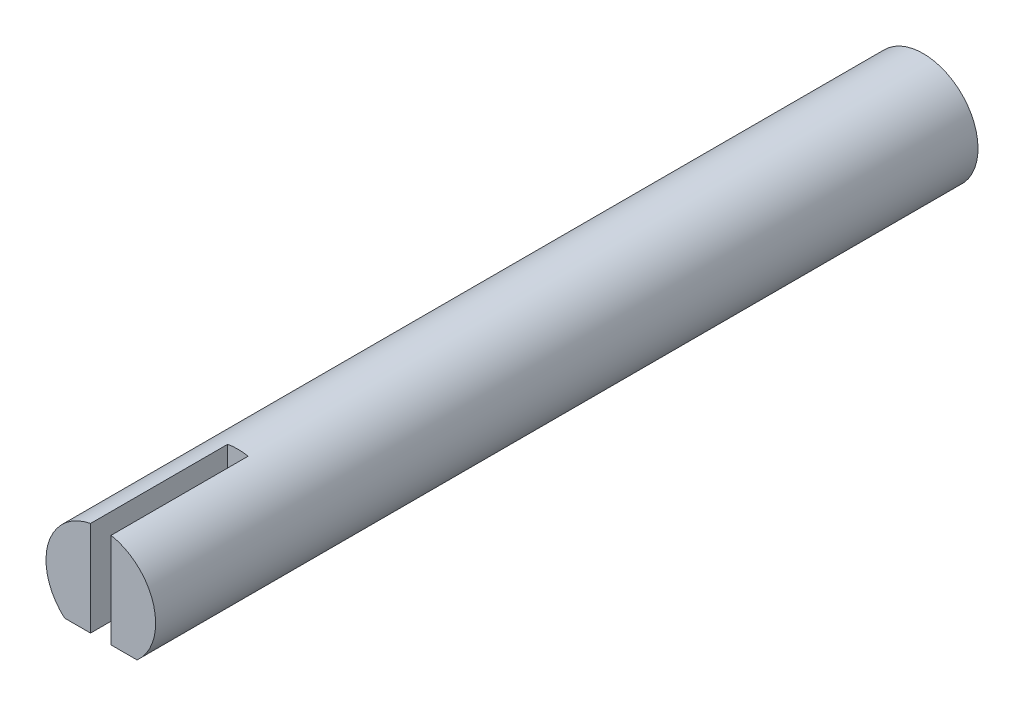
ISO-10303-21;
HEADER;
FILE_DESCRIPTION(('STEP AP214'),'2;1');
FILE_NAME('part.step','',(''),(''),'','','');
FILE_SCHEMA(('AUTOMOTIVE_DESIGN { 1 0 10303 214 1 1 1 1 }'));
ENDSEC;
DATA;
#1=APPLICATION_CONTEXT('core data for automotive mechanical design processes');
#2=APPLICATION_PROTOCOL_DEFINITION('international standard','automotive_design',2000,#1);
#3=PRODUCT_CONTEXT('',#1,'mechanical');
#4=PRODUCT('Part','Part','',(#3));
#5=PRODUCT_RELATED_PRODUCT_CATEGORY('part','',(#4));
#6=PRODUCT_DEFINITION_FORMATION('','',#4);
#7=PRODUCT_DEFINITION_CONTEXT('part definition',#1,'design');
#8=PRODUCT_DEFINITION('design','',#6,#7);
#9=PRODUCT_DEFINITION_SHAPE('','',#8);
#10=(LENGTH_UNIT() NAMED_UNIT(*) SI_UNIT(.MILLI.,.METRE.));
#11=(NAMED_UNIT(*) PLANE_ANGLE_UNIT() SI_UNIT($,.RADIAN.));
#12=(NAMED_UNIT(*) SI_UNIT($,.STERADIAN.) SOLID_ANGLE_UNIT());
#13=UNCERTAINTY_MEASURE_WITH_UNIT(LENGTH_MEASURE(1.E-05),#10,'distance_accuracy_value','');
#14=(GEOMETRIC_REPRESENTATION_CONTEXT(3) GLOBAL_UNCERTAINTY_ASSIGNED_CONTEXT((#13)) GLOBAL_UNIT_ASSIGNED_CONTEXT((#10,
#11,#12)) REPRESENTATION_CONTEXT('',''));
#15=CARTESIAN_POINT('',(0.,0.,0.));
#16=DIRECTION('',(0.,0.,1.));
#17=DIRECTION('',(1.,0.,0.));
#18=AXIS2_PLACEMENT_3D('',#15,#16,#17);
#19=CARTESIAN_POINT('',(0.,0.,60.));
#20=DIRECTION('',(0.,0.,1.));
#21=DIRECTION('',(1.,0.,0.));
#22=AXIS2_PLACEMENT_3D('',#19,#20,#21);
#23=PLANE('',#22);
#24=DIRECTION('',(0.,-1.,0.));
#25=VECTOR('',#24,1.);
#26=CARTESIAN_POINT('',(-0.75,0.,60.));
#27=LINE('',#26,#25);
#28=CARTESIAN_POINT('',(-0.75,3.92905841137543,60.));
#29=VERTEX_POINT('',#28);
#30=CARTESIAN_POINT('',(-0.75,-3.,60.));
#31=VERTEX_POINT('',#30);
#32=EDGE_CURVE('E48',#29,#31,#27,.T.);
#33=ORIENTED_EDGE('',*,*,#32,.F.);
#34=CARTESIAN_POINT('',(0.,0.,60.));
#35=DIRECTION('',(0.,0.,1.));
#36=DIRECTION('',(1.,0.,0.));
#37=AXIS2_PLACEMENT_3D('',#34,#35,#36);
#38=CIRCLE('',#37,4.);
#39=CARTESIAN_POINT('',(-2.64575131106459,-3.,60.));
#40=VERTEX_POINT('',#39);
#41=EDGE_CURVE('E89',#29,#40,#38,.T.);
#42=ORIENTED_EDGE('',*,*,#41,.T.);
#43=DIRECTION('',(1.,0.,0.));
#44=VECTOR('',#43,1.);
#45=CARTESIAN_POINT('',(-2.64575131106459,-3.,60.));
#46=LINE('',#45,#44);
#47=EDGE_CURVE('E97',#40,#31,#46,.T.);
#48=ORIENTED_EDGE('',*,*,#47,.T.);
#49=EDGE_LOOP('',(#33,#42,#48));
#50=FACE_BOUND('',#49,.T.);
#51=ADVANCED_FACE('F39',(#50),#23,.T.);
#52=CARTESIAN_POINT('',(0.,0.,60.));
#53=DIRECTION('',(0.,0.,-1.));
#54=DIRECTION('',(-1.,0.,0.));
#55=AXIS2_PLACEMENT_3D('',#52,#53,#54);
#56=CYLINDRICAL_SURFACE('',#55,4.);
#57=ORIENTED_EDGE('',*,*,#41,.F.);
#58=DIRECTION('',(0.,0.,-1.));
#59=VECTOR('',#58,1.);
#60=CARTESIAN_POINT('',(-0.75,3.92905841137543,60.));
#61=LINE('',#60,#59);
#62=CARTESIAN_POINT('',(-0.75,3.92905841137543,50.));
#63=VERTEX_POINT('',#62);
#64=EDGE_CURVE('E105',#29,#63,#61,.T.);
#65=ORIENTED_EDGE('',*,*,#64,.T.);
#66=CARTESIAN_POINT('',(0.,0.,50.));
#67=DIRECTION('',(0.,0.,1.));
#68=DIRECTION('',(1.,0.,0.));
#69=AXIS2_PLACEMENT_3D('',#66,#67,#68);
#70=CIRCLE('',#69,4.);
#71=CARTESIAN_POINT('',(0.75,3.92905841137543,50.));
#72=VERTEX_POINT('',#71);
#73=EDGE_CURVE('E101',#72,#63,#70,.T.);
#74=ORIENTED_EDGE('',*,*,#73,.F.);
#75=DIRECTION('',(0.,0.,-1.));
#76=VECTOR('',#75,1.);
#77=CARTESIAN_POINT('',(0.75,3.92905841137543,60.));
#78=LINE('',#77,#76);
#79=CARTESIAN_POINT('',(0.75,3.92905841137543,60.));
#80=VERTEX_POINT('',#79);
#81=EDGE_CURVE('E133',#72,#80,#78,.F.);
#82=ORIENTED_EDGE('',*,*,#81,.T.);
#83=CARTESIAN_POINT('',(2.64575131106459,-3.,60.));
#84=VERTEX_POINT('',#83);
#85=EDGE_CURVE('E95',#84,#80,#38,.T.);
#86=ORIENTED_EDGE('',*,*,#85,.F.);
#87=DIRECTION('',(0.,0.,-1.));
#88=VECTOR('',#87,1.);
#89=CARTESIAN_POINT('',(2.64575131106459,-3.,60.));
#90=LINE('',#89,#88);
#91=CARTESIAN_POINT('',(2.64575131106459,-3.,0.));
#92=VERTEX_POINT('',#91);
#93=EDGE_CURVE('E80',#84,#92,#90,.T.);
#94=ORIENTED_EDGE('',*,*,#93,.T.);
#95=CARTESIAN_POINT('',(0.,0.,0.));
#96=DIRECTION('',(0.,0.,1.));
#97=DIRECTION('',(1.,0.,0.));
#98=AXIS2_PLACEMENT_3D('',#95,#96,#97);
#99=CIRCLE('',#98,4.);
#100=CARTESIAN_POINT('',(-2.64575131106459,-3.,0.));
#101=VERTEX_POINT('',#100);
#102=EDGE_CURVE('E90',#92,#101,#99,.T.);
#103=ORIENTED_EDGE('',*,*,#102,.T.);
#104=DIRECTION('',(0.,0.,-1.));
#105=VECTOR('',#104,1.);
#106=CARTESIAN_POINT('',(-2.64575131106459,-3.,60.));
#107=LINE('',#106,#105);
#108=EDGE_CURVE('E84',#40,#101,#107,.T.);
#109=ORIENTED_EDGE('',*,*,#108,.F.);
#110=EDGE_LOOP('',(#57,#65,#74,#82,#86,#94,#103,#109));
#111=FACE_BOUND('',#110,.T.);
#112=ADVANCED_FACE('F41',(#111),#56,.T.);
#113=CARTESIAN_POINT('',(-2.64575131106459,-3.,60.));
#114=DIRECTION('',(0.,1.,0.));
#115=DIRECTION('',(0.,0.,1.));
#116=AXIS2_PLACEMENT_3D('',#113,#114,#115);
#117=PLANE('',#116);
#118=DIRECTION('',(1.,0.,0.));
#119=VECTOR('',#118,1.);
#120=CARTESIAN_POINT('',(-2.64575131106459,-3.,50.));
#121=LINE('',#120,#119);
#122=CARTESIAN_POINT('',(-0.75,-3.,50.));
#123=VERTEX_POINT('',#122);
#124=CARTESIAN_POINT('',(0.75,-3.,50.));
#125=VERTEX_POINT('',#124);
#126=EDGE_CURVE('E11',#123,#125,#121,.T.);
#127=ORIENTED_EDGE('',*,*,#126,.F.);
#128=DIRECTION('',(0.,0.,1.));
#129=VECTOR('',#128,1.);
#130=CARTESIAN_POINT('',(-0.75,-3.,60.));
#131=LINE('',#130,#129);
#132=EDGE_CURVE('E124',#123,#31,#131,.T.);
#133=ORIENTED_EDGE('',*,*,#132,.T.);
#134=ORIENTED_EDGE('',*,*,#47,.F.);
#135=ORIENTED_EDGE('',*,*,#108,.T.);
#136=DIRECTION('',(1.,0.,0.));
#137=VECTOR('',#136,1.);
#138=CARTESIAN_POINT('',(-2.64575131106459,-3.,0.));
#139=LINE('',#138,#137);
#140=EDGE_CURVE('E76',#101,#92,#139,.T.);
#141=ORIENTED_EDGE('',*,*,#140,.T.);
#142=ORIENTED_EDGE('',*,*,#93,.F.);
#143=CARTESIAN_POINT('',(0.75,-3.,60.));
#144=VERTEX_POINT('',#143);
#145=EDGE_CURVE('E63',#144,#84,#46,.T.);
#146=ORIENTED_EDGE('',*,*,#145,.F.);
#147=DIRECTION('',(0.,0.,-1.));
#148=VECTOR('',#147,1.);
#149=CARTESIAN_POINT('',(0.75,-3.,60.));
#150=LINE('',#149,#148);
#151=EDGE_CURVE('E55',#144,#125,#150,.T.);
#152=ORIENTED_EDGE('',*,*,#151,.T.);
#153=EDGE_LOOP('',(#127,#133,#134,#135,#141,#142,#146,#152));
#154=FACE_BOUND('',#153,.T.);
#155=ADVANCED_FACE('F79',(#154),#117,.F.);
#156=DIRECTION('',(0.,1.,0.));
#157=VECTOR('',#156,1.);
#158=CARTESIAN_POINT('',(0.75,0.,60.));
#159=LINE('',#158,#157);
#160=EDGE_CURVE('E112',#144,#80,#159,.T.);
#161=ORIENTED_EDGE('',*,*,#160,.F.);
#162=ORIENTED_EDGE('',*,*,#145,.T.);
#163=ORIENTED_EDGE('',*,*,#85,.T.);
#164=EDGE_LOOP('',(#161,#162,#163));
#165=FACE_BOUND('',#164,.T.);
#166=ADVANCED_FACE('F165',(#165),#23,.T.);
#167=CARTESIAN_POINT('',(0.,0.,0.));
#168=DIRECTION('',(0.,0.,1.));
#169=DIRECTION('',(1.,0.,0.));
#170=AXIS2_PLACEMENT_3D('',#167,#168,#169);
#171=PLANE('',#170);
#172=ORIENTED_EDGE('',*,*,#102,.F.);
#173=ORIENTED_EDGE('',*,*,#140,.F.);
#174=EDGE_LOOP('',(#172,#173));
#175=FACE_BOUND('',#174,.T.);
#176=ADVANCED_FACE('F99',(#175),#171,.F.);
#177=CARTESIAN_POINT('',(0.,0.,50.));
#178=DIRECTION('',(0.,0.,1.));
#179=DIRECTION('',(1.,0.,0.));
#180=AXIS2_PLACEMENT_3D('',#177,#178,#179);
#181=PLANE('',#180);
#182=ORIENTED_EDGE('',*,*,#73,.T.);
#183=DIRECTION('',(0.,-1.,0.));
#184=VECTOR('',#183,1.);
#185=CARTESIAN_POINT('',(-0.75,-4.,50.));
#186=LINE('',#185,#184);
#187=EDGE_CURVE('E147',#63,#123,#186,.T.);
#188=ORIENTED_EDGE('',*,*,#187,.T.);
#189=ORIENTED_EDGE('',*,*,#126,.T.);
#190=DIRECTION('',(0.,1.,0.));
#191=VECTOR('',#190,1.);
#192=CARTESIAN_POINT('',(0.75,-4.,50.));
#193=LINE('',#192,#191);
#194=EDGE_CURVE('E150',#125,#72,#193,.T.);
#195=ORIENTED_EDGE('',*,*,#194,.T.);
#196=EDGE_LOOP('',(#182,#188,#189,#195));
#197=FACE_BOUND('',#196,.T.);
#198=ADVANCED_FACE('F156',(#197),#181,.T.);
#199=CARTESIAN_POINT('',(-0.75,-4.,50.));
#200=DIRECTION('',(-1.,0.,0.));
#201=DIRECTION('',(0.,0.,1.));
#202=AXIS2_PLACEMENT_3D('',#199,#200,#201);
#203=PLANE('',#202);
#204=ORIENTED_EDGE('',*,*,#32,.T.);
#205=ORIENTED_EDGE('',*,*,#132,.F.);
#206=ORIENTED_EDGE('',*,*,#187,.F.);
#207=ORIENTED_EDGE('',*,*,#64,.F.);
#208=EDGE_LOOP('',(#204,#205,#206,#207));
#209=FACE_BOUND('',#208,.T.);
#210=ADVANCED_FACE('F122',(#209),#203,.F.);
#211=CARTESIAN_POINT('',(0.75,-4.,50.));
#212=DIRECTION('',(1.,0.,0.));
#213=DIRECTION('',(0.,0.,-1.));
#214=AXIS2_PLACEMENT_3D('',#211,#212,#213);
#215=PLANE('',#214);
#216=ORIENTED_EDGE('',*,*,#194,.F.);
#217=ORIENTED_EDGE('',*,*,#151,.F.);
#218=ORIENTED_EDGE('',*,*,#160,.T.);
#219=ORIENTED_EDGE('',*,*,#81,.F.);
#220=EDGE_LOOP('',(#216,#217,#218,#219));
#221=FACE_BOUND('',#220,.T.);
#222=ADVANCED_FACE('F164',(#221),#215,.F.);
#223=CLOSED_SHELL('',(#51,#112,#155,#166,#176,#198,#210,#222));
#224=MANIFOLD_SOLID_BREP('B2',#223);
#225=ADVANCED_BREP_SHAPE_REPRESENTATION('',(#18,#224),#14);
#226=SHAPE_DEFINITION_REPRESENTATION(#9,#225);
ENDSEC;
END-ISO-10303-21;
